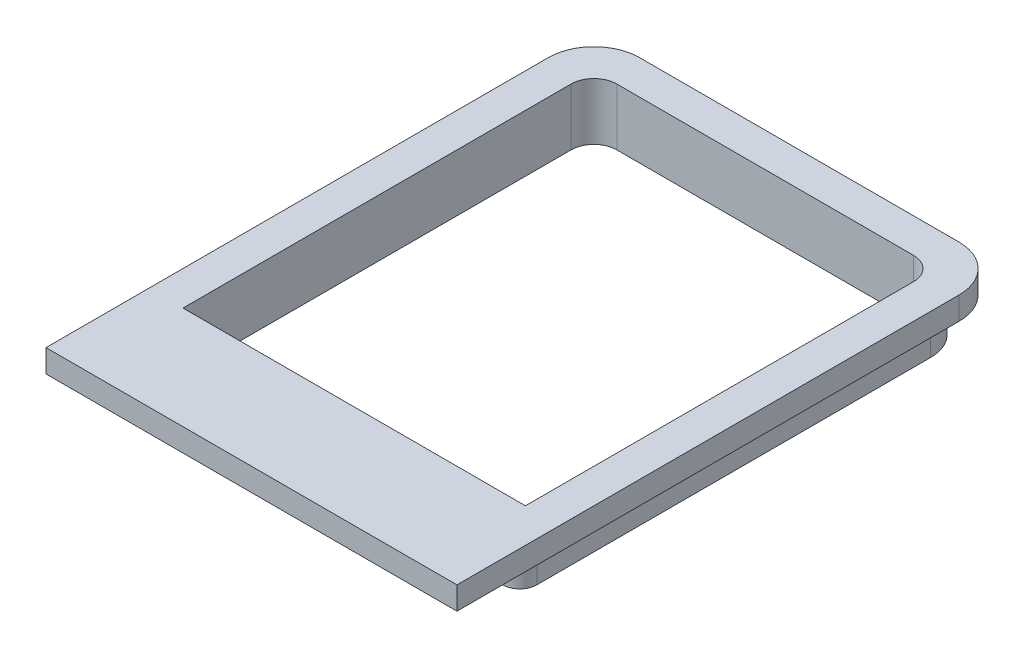
ISO-10303-21;
HEADER;
FILE_DESCRIPTION(('STEP AP214'),'2;1');
FILE_NAME('part.step','',(''),(''),'','','');
FILE_SCHEMA(('AUTOMOTIVE_DESIGN { 1 0 10303 214 1 1 1 1 }'));
ENDSEC;
DATA;
#1=APPLICATION_CONTEXT('core data for automotive mechanical design processes');
#2=APPLICATION_PROTOCOL_DEFINITION('international standard','automotive_design',2000,#1);
#3=PRODUCT_CONTEXT('',#1,'mechanical');
#4=PRODUCT('Part','Part','',(#3));
#5=PRODUCT_RELATED_PRODUCT_CATEGORY('part','',(#4));
#6=PRODUCT_DEFINITION_FORMATION('','',#4);
#7=PRODUCT_DEFINITION_CONTEXT('part definition',#1,'design');
#8=PRODUCT_DEFINITION('design','',#6,#7);
#9=PRODUCT_DEFINITION_SHAPE('','',#8);
#10=(LENGTH_UNIT() NAMED_UNIT(*) SI_UNIT(.MILLI.,.METRE.));
#11=(NAMED_UNIT(*) PLANE_ANGLE_UNIT() SI_UNIT($,.RADIAN.));
#12=(NAMED_UNIT(*) SI_UNIT($,.STERADIAN.) SOLID_ANGLE_UNIT());
#13=UNCERTAINTY_MEASURE_WITH_UNIT(LENGTH_MEASURE(1.E-05),#10,'distance_accuracy_value','');
#14=(GEOMETRIC_REPRESENTATION_CONTEXT(3) GLOBAL_UNCERTAINTY_ASSIGNED_CONTEXT((#13)) GLOBAL_UNIT_ASSIGNED_CONTEXT((#10,
#11,#12)) REPRESENTATION_CONTEXT('',''));
#15=CARTESIAN_POINT('',(0.,0.,0.));
#16=DIRECTION('',(0.,0.,1.));
#17=DIRECTION('',(1.,0.,0.));
#18=AXIS2_PLACEMENT_3D('',#15,#16,#17);
#19=CARTESIAN_POINT('',(6.50000000000001,9.5,-9.5));
#20=DIRECTION('',(0.,1.,0.));
#21=DIRECTION('',(0.,0.,1.));
#22=AXIS2_PLACEMENT_3D('',#19,#20,#21);
#23=PLANE('',#22);
#24=DIRECTION('',(0.,0.,1.));
#25=VECTOR('',#24,1.);
#26=CARTESIAN_POINT('',(-8.25000000000001,9.5,7.75));
#27=LINE('',#26,#25);
#28=CARTESIAN_POINT('',(-8.25,9.5,-9.49999999999999));
#29=VERTEX_POINT('',#28);
#30=CARTESIAN_POINT('',(-8.25000000000001,9.5,7.75));
#31=VERTEX_POINT('',#30);
#32=EDGE_CURVE('E138',#29,#31,#27,.T.);
#33=ORIENTED_EDGE('',*,*,#32,.F.);
#34=CARTESIAN_POINT('',(-6.5,9.5,-9.5));
#35=DIRECTION('',(0.,1.,0.));
#36=DIRECTION('',(0.,0.,1.));
#37=AXIS2_PLACEMENT_3D('',#34,#35,#36);
#38=CIRCLE('',#37,1.75);
#39=CARTESIAN_POINT('',(-6.50000000000001,9.5,-11.25));
#40=VERTEX_POINT('',#39);
#41=EDGE_CURVE('E215',#40,#29,#38,.T.);
#42=ORIENTED_EDGE('',*,*,#41,.F.);
#43=DIRECTION('',(-1.,0.,0.));
#44=VECTOR('',#43,1.);
#45=CARTESIAN_POINT('',(-6.50000000000001,9.5,-11.25));
#46=LINE('',#45,#44);
#47=CARTESIAN_POINT('',(6.50000000000001,9.5,-11.25));
#48=VERTEX_POINT('',#47);
#49=EDGE_CURVE('E210',#48,#40,#46,.T.);
#50=ORIENTED_EDGE('',*,*,#49,.F.);
#51=CARTESIAN_POINT('',(6.50000000000001,9.5,-9.5));
#52=DIRECTION('',(0.,1.,0.));
#53=DIRECTION('',(0.,0.,1.));
#54=AXIS2_PLACEMENT_3D('',#51,#52,#53);
#55=CIRCLE('',#54,1.75);
#56=CARTESIAN_POINT('',(8.25000000000001,9.5,-9.5));
#57=VERTEX_POINT('',#56);
#58=EDGE_CURVE('E202',#57,#48,#55,.T.);
#59=ORIENTED_EDGE('',*,*,#58,.F.);
#60=DIRECTION('',(0.,0.,-1.));
#61=VECTOR('',#60,1.);
#62=CARTESIAN_POINT('',(8.25000000000001,9.5,-9.5));
#63=LINE('',#62,#61);
#64=CARTESIAN_POINT('',(8.25000000000001,9.5,7.75));
#65=VERTEX_POINT('',#64);
#66=EDGE_CURVE('E201',#65,#57,#63,.T.);
#67=ORIENTED_EDGE('',*,*,#66,.F.);
#68=CARTESIAN_POINT('',(7.50000000000001,9.5,7.75));
#69=DIRECTION('',(0.,1.,0.));
#70=DIRECTION('',(0.,0.,1.));
#71=AXIS2_PLACEMENT_3D('',#68,#69,#70);
#72=CIRCLE('',#71,0.749999999999999);
#73=CARTESIAN_POINT('',(7.50000000000001,9.5,8.5));
#74=VERTEX_POINT('',#73);
#75=EDGE_CURVE('E331',#74,#65,#72,.T.);
#76=ORIENTED_EDGE('',*,*,#75,.F.);
#77=DIRECTION('',(0.,0.,1.));
#78=VECTOR('',#77,1.);
#79=CARTESIAN_POINT('',(7.50000000000001,9.5,8.5));
#80=LINE('',#79,#78);
#81=CARTESIAN_POINT('',(7.50000000000001,9.5,7.5));
#82=VERTEX_POINT('',#81);
#83=EDGE_CURVE('E325',#82,#74,#80,.T.);
#84=ORIENTED_EDGE('',*,*,#83,.F.);
#85=CARTESIAN_POINT('',(7.50000000000001,9.5,-9.5));
#86=VERTEX_POINT('',#85);
#87=EDGE_CURVE('E235',#86,#82,#80,.T.);
#88=ORIENTED_EDGE('',*,*,#87,.F.);
#89=CARTESIAN_POINT('',(6.50000000000001,9.5,-9.5));
#90=DIRECTION('',(0.,1.,0.));
#91=DIRECTION('',(0.,0.,1.));
#92=AXIS2_PLACEMENT_3D('',#89,#90,#91);
#93=CIRCLE('',#92,1.);
#94=CARTESIAN_POINT('',(6.5,9.5,-10.5));
#95=VERTEX_POINT('',#94);
#96=EDGE_CURVE('E236',#95,#86,#93,.F.);
#97=ORIENTED_EDGE('',*,*,#96,.F.);
#98=DIRECTION('',(1.,0.,0.));
#99=VECTOR('',#98,1.);
#100=CARTESIAN_POINT('',(6.5,9.5,-10.5));
#101=LINE('',#100,#99);
#102=CARTESIAN_POINT('',(-6.5,9.5,-10.5));
#103=VERTEX_POINT('',#102);
#104=EDGE_CURVE('E239',#103,#95,#101,.T.);
#105=ORIENTED_EDGE('',*,*,#104,.F.);
#106=CARTESIAN_POINT('',(-6.5,9.5,-9.5));
#107=DIRECTION('',(0.,1.,0.));
#108=DIRECTION('',(0.,0.,1.));
#109=AXIS2_PLACEMENT_3D('',#106,#107,#108);
#110=CIRCLE('',#109,1.);
#111=CARTESIAN_POINT('',(-7.5,9.5,-9.5));
#112=VERTEX_POINT('',#111);
#113=EDGE_CURVE('E242',#112,#103,#110,.F.);
#114=ORIENTED_EDGE('',*,*,#113,.F.);
#115=DIRECTION('',(0.,0.,-1.));
#116=VECTOR('',#115,1.);
#117=CARTESIAN_POINT('',(-7.5,9.5,-9.5));
#118=LINE('',#117,#116);
#119=CARTESIAN_POINT('',(-7.5,9.5,7.5));
#120=VERTEX_POINT('',#119);
#121=EDGE_CURVE('E234',#120,#112,#118,.T.);
#122=ORIENTED_EDGE('',*,*,#121,.F.);
#123=CARTESIAN_POINT('',(-7.5,9.5,8.5));
#124=VERTEX_POINT('',#123);
#125=EDGE_CURVE('E323',#124,#120,#118,.T.);
#126=ORIENTED_EDGE('',*,*,#125,.F.);
#127=CARTESIAN_POINT('',(-7.50000000000001,9.5,7.75));
#128=DIRECTION('',(0.,1.,0.));
#129=DIRECTION('',(0.,0.,1.));
#130=AXIS2_PLACEMENT_3D('',#127,#128,#129);
#131=CIRCLE('',#130,0.75);
#132=EDGE_CURVE('E223',#31,#124,#131,.T.);
#133=ORIENTED_EDGE('',*,*,#132,.F.);
#134=EDGE_LOOP('',(#33,#42,#50,#59,#67,#76,#84,#88,#97,#105,#114,#122,#126,#133));
#135=FACE_BOUND('',#134,.T.);
#136=ADVANCED_FACE('F41',(#135),#23,.F.);
#137=CARTESIAN_POINT('',(-7.,11.,26.8660687473185));
#138=DIRECTION('',(0.,1.,0.));
#139=DIRECTION('',(0.,0.,1.));
#140=AXIS2_PLACEMENT_3D('',#137,#138,#139);
#141=PLANE('',#140);
#142=DIRECTION('',(0.,0.,-1.));
#143=VECTOR('',#142,1.);
#144=CARTESIAN_POINT('',(9.00000000000001,11.,-12.));
#145=LINE('',#144,#143);
#146=CARTESIAN_POINT('',(9.00000000000001,11.,12.));
#147=VERTEX_POINT('',#146);
#148=CARTESIAN_POINT('',(9.00000000000001,11.,-10.));
#149=VERTEX_POINT('',#148);
#150=EDGE_CURVE('E245',#147,#149,#145,.T.);
#151=ORIENTED_EDGE('',*,*,#150,.F.);
#152=DIRECTION('',(-1.,0.,0.));
#153=VECTOR('',#152,1.);
#154=CARTESIAN_POINT('',(-7.,11.,12.));
#155=LINE('',#154,#153);
#156=CARTESIAN_POINT('',(-9.00000000000001,11.,12.));
#157=VERTEX_POINT('',#156);
#158=EDGE_CURVE('E58',#147,#157,#155,.T.);
#159=ORIENTED_EDGE('',*,*,#158,.T.);
#160=DIRECTION('',(0.,0.,-1.));
#161=VECTOR('',#160,1.);
#162=CARTESIAN_POINT('',(-9.00000000000001,11.,-10.));
#163=LINE('',#162,#161);
#164=CARTESIAN_POINT('',(-9.00000000000001,11.,-10.));
#165=VERTEX_POINT('',#164);
#166=EDGE_CURVE('E257',#157,#165,#163,.T.);
#167=ORIENTED_EDGE('',*,*,#166,.T.);
#168=CARTESIAN_POINT('',(-7.,11.,-10.));
#169=DIRECTION('',(0.,1.,0.));
#170=DIRECTION('',(0.,0.,1.));
#171=AXIS2_PLACEMENT_3D('',#168,#169,#170);
#172=CIRCLE('',#171,2.);
#173=CARTESIAN_POINT('',(-7.,11.,-12.));
#174=VERTEX_POINT('',#173);
#175=EDGE_CURVE('E254',#165,#174,#172,.F.);
#176=ORIENTED_EDGE('',*,*,#175,.T.);
#177=DIRECTION('',(1.,0.,0.));
#178=VECTOR('',#177,1.);
#179=CARTESIAN_POINT('',(7.,11.,-12.));
#180=LINE('',#179,#178);
#181=CARTESIAN_POINT('',(7.,11.,-12.));
#182=VERTEX_POINT('',#181);
#183=EDGE_CURVE('E251',#174,#182,#180,.T.);
#184=ORIENTED_EDGE('',*,*,#183,.T.);
#185=CARTESIAN_POINT('',(7.,11.,-10.));
#186=DIRECTION('',(0.,1.,0.));
#187=DIRECTION('',(0.,0.,1.));
#188=AXIS2_PLACEMENT_3D('',#185,#186,#187);
#189=CIRCLE('',#188,2.);
#190=EDGE_CURVE('E248',#182,#149,#189,.F.);
#191=ORIENTED_EDGE('',*,*,#190,.T.);
#192=EDGE_LOOP('',(#151,#159,#167,#176,#184,#191));
#193=FACE_BOUND('',#192,.T.);
#194=DIRECTION('',(0.,0.,1.));
#195=VECTOR('',#194,1.);
#196=CARTESIAN_POINT('',(-7.5,11.,-9.5));
#197=LINE('',#196,#195);
#198=CARTESIAN_POINT('',(-7.5,11.,7.5));
#199=VERTEX_POINT('',#198);
#200=CARTESIAN_POINT('',(-7.5,11.,8.5));
#201=VERTEX_POINT('',#200);
#202=EDGE_CURVE('E11',#199,#201,#197,.T.);
#203=ORIENTED_EDGE('',*,*,#202,.F.);
#204=DIRECTION('',(-1.,0.,0.));
#205=VECTOR('',#204,1.);
#206=CARTESIAN_POINT('',(-7.5,11.,7.5));
#207=LINE('',#206,#205);
#208=CARTESIAN_POINT('',(7.50000000000001,11.,7.5));
#209=VERTEX_POINT('',#208);
#210=EDGE_CURVE('E231',#209,#199,#207,.T.);
#211=ORIENTED_EDGE('',*,*,#210,.F.);
#212=DIRECTION('',(0.,0.,-1.));
#213=VECTOR('',#212,1.);
#214=CARTESIAN_POINT('',(7.50000000000001,11.,8.5));
#215=LINE('',#214,#213);
#216=CARTESIAN_POINT('',(7.50000000000001,11.,8.5));
#217=VERTEX_POINT('',#216);
#218=EDGE_CURVE('E50',#217,#209,#215,.T.);
#219=ORIENTED_EDGE('',*,*,#218,.F.);
#220=CARTESIAN_POINT('',(7.50000000000001,11.,7.75));
#221=DIRECTION('',(0.,-1.,0.));
#222=DIRECTION('',(0.,0.,-1.));
#223=AXIS2_PLACEMENT_3D('',#220,#221,#222);
#224=CIRCLE('',#223,0.749999999999999);
#225=CARTESIAN_POINT('',(8.25000000000001,11.,7.75));
#226=VERTEX_POINT('',#225);
#227=EDGE_CURVE('E183',#226,#217,#224,.T.);
#228=ORIENTED_EDGE('',*,*,#227,.F.);
#229=DIRECTION('',(0.,0.,1.));
#230=VECTOR('',#229,1.);
#231=CARTESIAN_POINT('',(8.25000000000001,11.,-9.5));
#232=LINE('',#231,#230);
#233=CARTESIAN_POINT('',(8.25000000000001,11.,-9.5));
#234=VERTEX_POINT('',#233);
#235=EDGE_CURVE('E178',#234,#226,#232,.T.);
#236=ORIENTED_EDGE('',*,*,#235,.F.);
#237=CARTESIAN_POINT('',(6.50000000000001,11.,-9.5));
#238=DIRECTION('',(0.,-1.,0.));
#239=DIRECTION('',(0.,0.,-1.));
#240=AXIS2_PLACEMENT_3D('',#237,#238,#239);
#241=CIRCLE('',#240,1.75);
#242=CARTESIAN_POINT('',(6.50000000000001,11.,-11.25));
#243=VERTEX_POINT('',#242);
#244=EDGE_CURVE('E181',#243,#234,#241,.T.);
#245=ORIENTED_EDGE('',*,*,#244,.F.);
#246=DIRECTION('',(1.,0.,0.));
#247=VECTOR('',#246,1.);
#248=CARTESIAN_POINT('',(-6.50000000000001,11.,-11.25));
#249=LINE('',#248,#247);
#250=CARTESIAN_POINT('',(-6.50000000000001,11.,-11.25));
#251=VERTEX_POINT('',#250);
#252=EDGE_CURVE('E197',#251,#243,#249,.T.);
#253=ORIENTED_EDGE('',*,*,#252,.F.);
#254=CARTESIAN_POINT('',(-6.5,11.,-9.5));
#255=DIRECTION('',(0.,-1.,0.));
#256=DIRECTION('',(0.,0.,-1.));
#257=AXIS2_PLACEMENT_3D('',#254,#255,#256);
#258=CIRCLE('',#257,1.75);
#259=CARTESIAN_POINT('',(-8.25,11.,-9.49999999999999));
#260=VERTEX_POINT('',#259);
#261=EDGE_CURVE('E311',#260,#251,#258,.T.);
#262=ORIENTED_EDGE('',*,*,#261,.F.);
#263=DIRECTION('',(0.,0.,-1.));
#264=VECTOR('',#263,1.);
#265=CARTESIAN_POINT('',(-8.25000000000001,11.,7.75));
#266=LINE('',#265,#264);
#267=CARTESIAN_POINT('',(-8.25000000000001,11.,7.75));
#268=VERTEX_POINT('',#267);
#269=EDGE_CURVE('E314',#268,#260,#266,.T.);
#270=ORIENTED_EDGE('',*,*,#269,.F.);
#271=CARTESIAN_POINT('',(-7.50000000000001,11.,7.75));
#272=DIRECTION('',(0.,-1.,0.));
#273=DIRECTION('',(0.,0.,-1.));
#274=AXIS2_PLACEMENT_3D('',#271,#272,#273);
#275=CIRCLE('',#274,0.75);
#276=EDGE_CURVE('E317',#201,#268,#275,.T.);
#277=ORIENTED_EDGE('',*,*,#276,.F.);
#278=EDGE_LOOP('',(#203,#211,#219,#228,#236,#245,#253,#262,#270,#277));
#279=FACE_BOUND('',#278,.T.);
#280=ADVANCED_FACE('F180',(#193,#279),#141,.F.);
#281=CARTESIAN_POINT('',(-7.5,1.5,-10.5));
#282=DIRECTION('',(1.,0.,0.));
#283=DIRECTION('',(0.,0.,-1.));
#284=AXIS2_PLACEMENT_3D('',#281,#282,#283);
#285=PLANE('',#284);
#286=ORIENTED_EDGE('',*,*,#125,.T.);
#287=DIRECTION('',(0.,1.,0.));
#288=VECTOR('',#287,1.);
#289=CARTESIAN_POINT('',(-7.5,7.998,7.5));
#290=LINE('',#289,#288);
#291=EDGE_CURVE('E260',#120,#199,#290,.T.);
#292=ORIENTED_EDGE('',*,*,#291,.T.);
#293=ORIENTED_EDGE('',*,*,#202,.T.);
#294=DIRECTION('',(0.,1.,0.));
#295=VECTOR('',#294,1.);
#296=CARTESIAN_POINT('',(-7.5,-0.00200000000000027,8.5));
#297=LINE('',#296,#295);
#298=EDGE_CURVE('E320',#124,#201,#297,.T.);
#299=ORIENTED_EDGE('',*,*,#298,.F.);
#300=EDGE_LOOP('',(#286,#292,#293,#299));
#301=FACE_BOUND('',#300,.T.);
#302=ADVANCED_FACE('F352',(#301),#285,.T.);
#303=CARTESIAN_POINT('',(7.50000000000001,1.5,-10.5));
#304=DIRECTION('',(-1.,0.,0.));
#305=DIRECTION('',(0.,0.,1.));
#306=AXIS2_PLACEMENT_3D('',#303,#304,#305);
#307=PLANE('',#306);
#308=ORIENTED_EDGE('',*,*,#218,.T.);
#309=DIRECTION('',(0.,1.,0.));
#310=VECTOR('',#309,1.);
#311=CARTESIAN_POINT('',(7.50000000000001,7.998,7.5));
#312=LINE('',#311,#310);
#313=EDGE_CURVE('E230',#82,#209,#312,.T.);
#314=ORIENTED_EDGE('',*,*,#313,.F.);
#315=ORIENTED_EDGE('',*,*,#83,.T.);
#316=DIRECTION('',(0.,1.,0.));
#317=VECTOR('',#316,1.);
#318=CARTESIAN_POINT('',(7.50000000000001,-0.00200000000000027,8.5));
#319=LINE('',#318,#317);
#320=EDGE_CURVE('E328',#74,#217,#319,.T.);
#321=ORIENTED_EDGE('',*,*,#320,.T.);
#322=EDGE_LOOP('',(#308,#314,#315,#321));
#323=FACE_BOUND('',#322,.T.);
#324=ADVANCED_FACE('F373',(#323),#307,.T.);
#325=CARTESIAN_POINT('',(7.50000000000001,-0.00200000000000027,7.75));
#326=DIRECTION('',(0.,1.,0.));
#327=DIRECTION('',(0.,0.,1.));
#328=AXIS2_PLACEMENT_3D('',#325,#326,#327);
#329=CYLINDRICAL_SURFACE('',#328,0.749999999999999);
#330=ORIENTED_EDGE('',*,*,#320,.F.);
#331=ORIENTED_EDGE('',*,*,#75,.T.);
#332=DIRECTION('',(0.,1.,0.));
#333=VECTOR('',#332,1.);
#334=CARTESIAN_POINT('',(8.25000000000001,-0.00200000000000027,7.75));
#335=LINE('',#334,#333);
#336=EDGE_CURVE('E204',#65,#226,#335,.T.);
#337=ORIENTED_EDGE('',*,*,#336,.T.);
#338=ORIENTED_EDGE('',*,*,#227,.T.);
#339=EDGE_LOOP('',(#330,#331,#337,#338));
#340=FACE_BOUND('',#339,.T.);
#341=ADVANCED_FACE('F334',(#340),#329,.T.);
#342=CARTESIAN_POINT('',(8.25000000000001,-0.00200000000000027,-9.5));
#343=DIRECTION('',(-1.,0.,0.));
#344=DIRECTION('',(0.,0.,1.));
#345=AXIS2_PLACEMENT_3D('',#342,#343,#344);
#346=PLANE('',#345);
#347=ORIENTED_EDGE('',*,*,#336,.F.);
#348=ORIENTED_EDGE('',*,*,#66,.T.);
#349=DIRECTION('',(0.,1.,0.));
#350=VECTOR('',#349,1.);
#351=CARTESIAN_POINT('',(8.25000000000001,-0.00200000000000027,-9.5));
#352=LINE('',#351,#350);
#353=EDGE_CURVE('E193',#57,#234,#352,.T.);
#354=ORIENTED_EDGE('',*,*,#353,.T.);
#355=ORIENTED_EDGE('',*,*,#235,.T.);
#356=EDGE_LOOP('',(#347,#348,#354,#355));
#357=FACE_BOUND('',#356,.T.);
#358=ADVANCED_FACE('F199',(#357),#346,.F.);
#359=CARTESIAN_POINT('',(6.50000000000001,-0.00200000000000027,-9.5));
#360=DIRECTION('',(0.,1.,0.));
#361=DIRECTION('',(0.,0.,1.));
#362=AXIS2_PLACEMENT_3D('',#359,#360,#361);
#363=CYLINDRICAL_SURFACE('',#362,1.75);
#364=ORIENTED_EDGE('',*,*,#353,.F.);
#365=ORIENTED_EDGE('',*,*,#58,.T.);
#366=DIRECTION('',(0.,1.,0.));
#367=VECTOR('',#366,1.);
#368=CARTESIAN_POINT('',(6.50000000000001,-0.00200000000000027,-11.25));
#369=LINE('',#368,#367);
#370=EDGE_CURVE('E196',#48,#243,#369,.T.);
#371=ORIENTED_EDGE('',*,*,#370,.T.);
#372=ORIENTED_EDGE('',*,*,#244,.T.);
#373=EDGE_LOOP('',(#364,#365,#371,#372));
#374=FACE_BOUND('',#373,.T.);
#375=ADVANCED_FACE('F192',(#374),#363,.T.);
#376=CARTESIAN_POINT('',(-6.50000000000001,-0.00200000000000027,-11.25));
#377=DIRECTION('',(0.,0.,1.));
#378=DIRECTION('',(1.,0.,0.));
#379=AXIS2_PLACEMENT_3D('',#376,#377,#378);
#380=PLANE('',#379);
#381=ORIENTED_EDGE('',*,*,#370,.F.);
#382=ORIENTED_EDGE('',*,*,#49,.T.);
#383=DIRECTION('',(0.,1.,0.));
#384=VECTOR('',#383,1.);
#385=CARTESIAN_POINT('',(-6.50000000000001,-0.00200000000000027,-11.25));
#386=LINE('',#385,#384);
#387=EDGE_CURVE('E212',#40,#251,#386,.T.);
#388=ORIENTED_EDGE('',*,*,#387,.T.);
#389=ORIENTED_EDGE('',*,*,#252,.T.);
#390=EDGE_LOOP('',(#381,#382,#388,#389));
#391=FACE_BOUND('',#390,.T.);
#392=ADVANCED_FACE('F340',(#391),#380,.F.);
#393=CARTESIAN_POINT('',(-6.5,-0.00200000000000027,-9.5));
#394=DIRECTION('',(0.,1.,0.));
#395=DIRECTION('',(0.,0.,1.));
#396=AXIS2_PLACEMENT_3D('',#393,#394,#395);
#397=CYLINDRICAL_SURFACE('',#396,1.75);
#398=ORIENTED_EDGE('',*,*,#387,.F.);
#399=ORIENTED_EDGE('',*,*,#41,.T.);
#400=DIRECTION('',(0.,1.,0.));
#401=VECTOR('',#400,1.);
#402=CARTESIAN_POINT('',(-8.25,-0.00200000000000027,-9.49999999999999));
#403=LINE('',#402,#401);
#404=EDGE_CURVE('E217',#29,#260,#403,.T.);
#405=ORIENTED_EDGE('',*,*,#404,.T.);
#406=ORIENTED_EDGE('',*,*,#261,.T.);
#407=EDGE_LOOP('',(#398,#399,#405,#406));
#408=FACE_BOUND('',#407,.T.);
#409=ADVANCED_FACE('F343',(#408),#397,.T.);
#410=CARTESIAN_POINT('',(-8.25000000000001,-0.00200000000000027,7.75));
#411=DIRECTION('',(1.,0.,0.));
#412=DIRECTION('',(0.,0.,-1.));
#413=AXIS2_PLACEMENT_3D('',#410,#411,#412);
#414=PLANE('',#413);
#415=ORIENTED_EDGE('',*,*,#404,.F.);
#416=ORIENTED_EDGE('',*,*,#32,.T.);
#417=DIRECTION('',(0.,1.,0.));
#418=VECTOR('',#417,1.);
#419=CARTESIAN_POINT('',(-8.25000000000001,-0.00200000000000027,7.75));
#420=LINE('',#419,#418);
#421=EDGE_CURVE('E221',#31,#268,#420,.T.);
#422=ORIENTED_EDGE('',*,*,#421,.T.);
#423=ORIENTED_EDGE('',*,*,#269,.T.);
#424=EDGE_LOOP('',(#415,#416,#422,#423));
#425=FACE_BOUND('',#424,.T.);
#426=ADVANCED_FACE('F344',(#425),#414,.F.);
#427=CARTESIAN_POINT('',(-7.50000000000001,-0.00200000000000027,7.75));
#428=DIRECTION('',(0.,1.,0.));
#429=DIRECTION('',(0.,0.,1.));
#430=AXIS2_PLACEMENT_3D('',#427,#428,#429);
#431=CYLINDRICAL_SURFACE('',#430,0.75);
#432=ORIENTED_EDGE('',*,*,#421,.F.);
#433=ORIENTED_EDGE('',*,*,#132,.T.);
#434=ORIENTED_EDGE('',*,*,#298,.T.);
#435=ORIENTED_EDGE('',*,*,#276,.T.);
#436=EDGE_LOOP('',(#432,#433,#434,#435));
#437=FACE_BOUND('',#436,.T.);
#438=ADVANCED_FACE('F349',(#437),#431,.T.);
#439=CARTESIAN_POINT('',(7.,12.,-10.));
#440=DIRECTION('',(0.,1.,0.));
#441=DIRECTION('',(0.,0.,1.));
#442=AXIS2_PLACEMENT_3D('',#439,#440,#441);
#443=PLANE('',#442);
#444=DIRECTION('',(-1.,0.,0.));
#445=VECTOR('',#444,1.);
#446=CARTESIAN_POINT('',(-9.00000000000001,12.,12.));
#447=LINE('',#446,#445);
#448=CARTESIAN_POINT('',(9.,12.,12.));
#449=VERTEX_POINT('',#448);
#450=CARTESIAN_POINT('',(-9.00000000000001,12.,12.));
#451=VERTEX_POINT('',#450);
#452=EDGE_CURVE('E586',#449,#451,#447,.T.);
#453=ORIENTED_EDGE('',*,*,#452,.F.);
#454=DIRECTION('',(0.,0.,-1.));
#455=VECTOR('',#454,1.);
#456=CARTESIAN_POINT('',(9.,12.,15.));
#457=LINE('',#456,#455);
#458=CARTESIAN_POINT('',(9.00000000000001,12.,-10.));
#459=VERTEX_POINT('',#458);
#460=EDGE_CURVE('E226',#449,#459,#457,.T.);
#461=ORIENTED_EDGE('',*,*,#460,.T.);
#462=CARTESIAN_POINT('',(7.,12.,-10.));
#463=DIRECTION('',(0.,1.,0.));
#464=DIRECTION('',(0.,0.,1.));
#465=AXIS2_PLACEMENT_3D('',#462,#463,#464);
#466=CIRCLE('',#465,2.);
#467=CARTESIAN_POINT('',(7.,12.,-12.));
#468=VERTEX_POINT('',#467);
#469=EDGE_CURVE('E591',#459,#468,#466,.T.);
#470=ORIENTED_EDGE('',*,*,#469,.T.);
#471=DIRECTION('',(-1.,0.,0.));
#472=VECTOR('',#471,1.);
#473=CARTESIAN_POINT('',(7.,12.,-12.));
#474=LINE('',#473,#472);
#475=CARTESIAN_POINT('',(-7.,12.,-12.));
#476=VERTEX_POINT('',#475);
#477=EDGE_CURVE('E590',#468,#476,#474,.T.);
#478=ORIENTED_EDGE('',*,*,#477,.T.);
#479=CARTESIAN_POINT('',(-7.,12.,-10.));
#480=DIRECTION('',(0.,1.,0.));
#481=DIRECTION('',(0.,0.,1.));
#482=AXIS2_PLACEMENT_3D('',#479,#480,#481);
#483=CIRCLE('',#482,2.);
#484=CARTESIAN_POINT('',(-9.00000000000001,12.,-10.));
#485=VERTEX_POINT('',#484);
#486=EDGE_CURVE('E589',#476,#485,#483,.T.);
#487=ORIENTED_EDGE('',*,*,#486,.T.);
#488=DIRECTION('',(0.,0.,1.));
#489=VECTOR('',#488,1.);
#490=CARTESIAN_POINT('',(-9.00000000000001,12.,-10.));
#491=LINE('',#490,#489);
#492=EDGE_CURVE('E295',#485,#451,#491,.T.);
#493=ORIENTED_EDGE('',*,*,#492,.T.);
#494=EDGE_LOOP('',(#453,#461,#470,#478,#487,#493));
#495=FACE_BOUND('',#494,.T.);
#496=CARTESIAN_POINT('',(-6.5,12.,-9.5));
#497=DIRECTION('',(0.,1.,0.));
#498=DIRECTION('',(0.,0.,1.));
#499=AXIS2_PLACEMENT_3D('',#496,#497,#498);
#500=CIRCLE('',#499,1.);
#501=CARTESIAN_POINT('',(-6.5,12.,-10.5));
#502=VERTEX_POINT('',#501);
#503=CARTESIAN_POINT('',(-7.5,12.,-9.5));
#504=VERTEX_POINT('',#503);
#505=EDGE_CURVE('E283',#502,#504,#500,.T.);
#506=ORIENTED_EDGE('',*,*,#505,.F.);
#507=DIRECTION('',(-1.,0.,0.));
#508=VECTOR('',#507,1.);
#509=CARTESIAN_POINT('',(6.5,12.,-10.5));
#510=LINE('',#509,#508);
#511=CARTESIAN_POINT('',(6.5,12.,-10.5));
#512=VERTEX_POINT('',#511);
#513=EDGE_CURVE('E305',#512,#502,#510,.T.);
#514=ORIENTED_EDGE('',*,*,#513,.F.);
#515=CARTESIAN_POINT('',(6.50000000000001,12.,-9.5));
#516=DIRECTION('',(0.,1.,0.));
#517=DIRECTION('',(0.,0.,1.));
#518=AXIS2_PLACEMENT_3D('',#515,#516,#517);
#519=CIRCLE('',#518,1.);
#520=CARTESIAN_POINT('',(7.50000000000001,12.,-9.5));
#521=VERTEX_POINT('',#520);
#522=EDGE_CURVE('E302',#521,#512,#519,.T.);
#523=ORIENTED_EDGE('',*,*,#522,.F.);
#524=DIRECTION('',(0.,0.,-1.));
#525=VECTOR('',#524,1.);
#526=CARTESIAN_POINT('',(7.50000000000001,12.,7.5));
#527=LINE('',#526,#525);
#528=CARTESIAN_POINT('',(7.50000000000001,12.,7.5));
#529=VERTEX_POINT('',#528);
#530=EDGE_CURVE('E299',#529,#521,#527,.T.);
#531=ORIENTED_EDGE('',*,*,#530,.F.);
#532=DIRECTION('',(1.,0.,0.));
#533=VECTOR('',#532,1.);
#534=CARTESIAN_POINT('',(-7.5,12.,7.5));
#535=LINE('',#534,#533);
#536=CARTESIAN_POINT('',(-7.5,12.,7.5));
#537=VERTEX_POINT('',#536);
#538=EDGE_CURVE('E292',#537,#529,#535,.T.);
#539=ORIENTED_EDGE('',*,*,#538,.F.);
#540=DIRECTION('',(0.,0.,1.));
#541=VECTOR('',#540,1.);
#542=CARTESIAN_POINT('',(-7.5,12.,-9.5));
#543=LINE('',#542,#541);
#544=EDGE_CURVE('E288',#504,#537,#543,.T.);
#545=ORIENTED_EDGE('',*,*,#544,.F.);
#546=EDGE_LOOP('',(#506,#514,#523,#531,#539,#545));
#547=FACE_BOUND('',#546,.T.);
#548=ADVANCED_FACE('F414',(#495,#547),#443,.T.);
#549=CARTESIAN_POINT('',(-7.5,7.998,-9.5));
#550=DIRECTION('',(-1.,0.,0.));
#551=DIRECTION('',(0.,0.,1.));
#552=AXIS2_PLACEMENT_3D('',#549,#550,#551);
#553=PLANE('',#552);
#554=DIRECTION('',(0.,1.,0.));
#555=VECTOR('',#554,1.);
#556=CARTESIAN_POINT('',(-7.5,7.998,-9.5));
#557=LINE('',#556,#555);
#558=EDGE_CURVE('E45',#112,#504,#557,.T.);
#559=ORIENTED_EDGE('',*,*,#558,.T.);
#560=ORIENTED_EDGE('',*,*,#544,.T.);
#561=EDGE_CURVE('E229',#199,#537,#290,.T.);
#562=ORIENTED_EDGE('',*,*,#561,.F.);
#563=ORIENTED_EDGE('',*,*,#291,.F.);
#564=ORIENTED_EDGE('',*,*,#121,.T.);
#565=EDGE_LOOP('',(#559,#560,#562,#563,#564));
#566=FACE_BOUND('',#565,.T.);
#567=ADVANCED_FACE('F43',(#566),#553,.F.);
#568=CARTESIAN_POINT('',(-7.5,7.998,7.5));
#569=DIRECTION('',(0.,0.,1.));
#570=DIRECTION('',(1.,0.,0.));
#571=AXIS2_PLACEMENT_3D('',#568,#569,#570);
#572=PLANE('',#571);
#573=EDGE_CURVE('E227',#209,#529,#312,.T.);
#574=ORIENTED_EDGE('',*,*,#573,.F.);
#575=ORIENTED_EDGE('',*,*,#210,.T.);
#576=ORIENTED_EDGE('',*,*,#561,.T.);
#577=ORIENTED_EDGE('',*,*,#538,.T.);
#578=EDGE_LOOP('',(#574,#575,#576,#577));
#579=FACE_BOUND('',#578,.T.);
#580=ADVANCED_FACE('F368',(#579),#572,.F.);
#581=CARTESIAN_POINT('',(7.50000000000001,7.998,7.5));
#582=DIRECTION('',(1.,0.,0.));
#583=DIRECTION('',(0.,0.,-1.));
#584=AXIS2_PLACEMENT_3D('',#581,#582,#583);
#585=PLANE('',#584);
#586=ORIENTED_EDGE('',*,*,#313,.T.);
#587=ORIENTED_EDGE('',*,*,#573,.T.);
#588=ORIENTED_EDGE('',*,*,#530,.T.);
#589=DIRECTION('',(0.,1.,0.));
#590=VECTOR('',#589,1.);
#591=CARTESIAN_POINT('',(7.50000000000001,7.998,-9.5));
#592=LINE('',#591,#590);
#593=EDGE_CURVE('E273',#86,#521,#592,.T.);
#594=ORIENTED_EDGE('',*,*,#593,.F.);
#595=ORIENTED_EDGE('',*,*,#87,.T.);
#596=EDGE_LOOP('',(#586,#587,#588,#594,#595));
#597=FACE_BOUND('',#596,.T.);
#598=ADVANCED_FACE('F358',(#597),#585,.F.);
#599=CARTESIAN_POINT('',(-6.5,7.998,-9.5));
#600=DIRECTION('',(0.,1.,0.));
#601=DIRECTION('',(0.,0.,1.));
#602=AXIS2_PLACEMENT_3D('',#599,#600,#601);
#603=CYLINDRICAL_SURFACE('',#602,1.);
#604=DIRECTION('',(0.,1.,0.));
#605=VECTOR('',#604,1.);
#606=CARTESIAN_POINT('',(-6.5,7.998,-10.5));
#607=LINE('',#606,#605);
#608=EDGE_CURVE('E269',#103,#502,#607,.T.);
#609=ORIENTED_EDGE('',*,*,#608,.T.);
#610=ORIENTED_EDGE('',*,*,#505,.T.);
#611=ORIENTED_EDGE('',*,*,#558,.F.);
#612=ORIENTED_EDGE('',*,*,#113,.T.);
#613=EDGE_LOOP('',(#609,#610,#611,#612));
#614=FACE_BOUND('',#613,.T.);
#615=ADVANCED_FACE('F355',(#614),#603,.F.);
#616=CARTESIAN_POINT('',(7.,7.998,-10.));
#617=DIRECTION('',(0.,1.,0.));
#618=DIRECTION('',(0.,0.,1.));
#619=AXIS2_PLACEMENT_3D('',#616,#617,#618);
#620=CYLINDRICAL_SURFACE('',#619,2.);
#621=ORIENTED_EDGE('',*,*,#190,.F.);
#622=DIRECTION('',(0.,1.,0.));
#623=VECTOR('',#622,1.);
#624=CARTESIAN_POINT('',(7.,7.998,-12.));
#625=LINE('',#624,#623);
#626=EDGE_CURVE('E264',#182,#468,#625,.T.);
#627=ORIENTED_EDGE('',*,*,#626,.T.);
#628=ORIENTED_EDGE('',*,*,#469,.F.);
#629=DIRECTION('',(0.,1.,0.));
#630=VECTOR('',#629,1.);
#631=CARTESIAN_POINT('',(9.00000000000001,7.998,-10.));
#632=LINE('',#631,#630);
#633=EDGE_CURVE('E261',#149,#459,#632,.T.);
#634=ORIENTED_EDGE('',*,*,#633,.F.);
#635=EDGE_LOOP('',(#621,#627,#628,#634));
#636=FACE_BOUND('',#635,.T.);
#637=ADVANCED_FACE('F357',(#636),#620,.T.);
#638=CARTESIAN_POINT('',(7.,7.998,-12.));
#639=DIRECTION('',(0.,0.,-1.));
#640=DIRECTION('',(-1.,0.,0.));
#641=AXIS2_PLACEMENT_3D('',#638,#639,#640);
#642=PLANE('',#641);
#643=ORIENTED_EDGE('',*,*,#183,.F.);
#644=DIRECTION('',(0.,1.,0.));
#645=VECTOR('',#644,1.);
#646=CARTESIAN_POINT('',(-7.,7.998,-12.));
#647=LINE('',#646,#645);
#648=EDGE_CURVE('E266',#174,#476,#647,.T.);
#649=ORIENTED_EDGE('',*,*,#648,.T.);
#650=ORIENTED_EDGE('',*,*,#477,.F.);
#651=ORIENTED_EDGE('',*,*,#626,.F.);
#652=EDGE_LOOP('',(#643,#649,#650,#651));
#653=FACE_BOUND('',#652,.T.);
#654=ADVANCED_FACE('F365',(#653),#642,.T.);
#655=CARTESIAN_POINT('',(-7.,7.998,-10.));
#656=DIRECTION('',(0.,1.,0.));
#657=DIRECTION('',(0.,0.,1.));
#658=AXIS2_PLACEMENT_3D('',#655,#656,#657);
#659=CYLINDRICAL_SURFACE('',#658,2.);
#660=ORIENTED_EDGE('',*,*,#175,.F.);
#661=DIRECTION('',(0.,1.,0.));
#662=VECTOR('',#661,1.);
#663=CARTESIAN_POINT('',(-9.00000000000001,7.998,-10.));
#664=LINE('',#663,#662);
#665=EDGE_CURVE('E129',#165,#485,#664,.T.);
#666=ORIENTED_EDGE('',*,*,#665,.T.);
#667=ORIENTED_EDGE('',*,*,#486,.F.);
#668=ORIENTED_EDGE('',*,*,#648,.F.);
#669=EDGE_LOOP('',(#660,#666,#667,#668));
#670=FACE_BOUND('',#669,.T.);
#671=ADVANCED_FACE('F387',(#670),#659,.T.);
#672=CARTESIAN_POINT('',(-9.00000000000001,7.998,-10.));
#673=DIRECTION('',(-1.,0.,0.));
#674=DIRECTION('',(0.,0.,1.));
#675=AXIS2_PLACEMENT_3D('',#672,#673,#674);
#676=PLANE('',#675);
#677=DIRECTION('',(0.,1.,0.));
#678=VECTOR('',#677,1.);
#679=CARTESIAN_POINT('',(-9.00000000000001,2.,12.));
#680=LINE('',#679,#678);
#681=EDGE_CURVE('E277',#157,#451,#680,.T.);
#682=ORIENTED_EDGE('',*,*,#681,.T.);
#683=ORIENTED_EDGE('',*,*,#492,.F.);
#684=ORIENTED_EDGE('',*,*,#665,.F.);
#685=ORIENTED_EDGE('',*,*,#166,.F.);
#686=EDGE_LOOP('',(#682,#683,#684,#685));
#687=FACE_BOUND('',#686,.T.);
#688=ADVANCED_FACE('F391',(#687),#676,.T.);
#689=CARTESIAN_POINT('',(9.,7.998,15.));
#690=DIRECTION('',(1.,0.,0.));
#691=DIRECTION('',(0.,0.,-1.));
#692=AXIS2_PLACEMENT_3D('',#689,#690,#691);
#693=PLANE('',#692);
#694=DIRECTION('',(0.,1.,0.));
#695=VECTOR('',#694,1.);
#696=CARTESIAN_POINT('',(9.,2.,12.));
#697=LINE('',#696,#695);
#698=EDGE_CURVE('E584',#147,#449,#697,.T.);
#699=ORIENTED_EDGE('',*,*,#698,.F.);
#700=ORIENTED_EDGE('',*,*,#150,.T.);
#701=ORIENTED_EDGE('',*,*,#633,.T.);
#702=ORIENTED_EDGE('',*,*,#460,.F.);
#703=EDGE_LOOP('',(#699,#700,#701,#702));
#704=FACE_BOUND('',#703,.T.);
#705=ADVANCED_FACE('F399',(#704),#693,.T.);
#706=CARTESIAN_POINT('',(6.50000000000001,7.998,-9.5));
#707=DIRECTION('',(0.,1.,0.));
#708=DIRECTION('',(0.,0.,1.));
#709=AXIS2_PLACEMENT_3D('',#706,#707,#708);
#710=CYLINDRICAL_SURFACE('',#709,1.);
#711=ORIENTED_EDGE('',*,*,#593,.T.);
#712=ORIENTED_EDGE('',*,*,#522,.T.);
#713=DIRECTION('',(0.,1.,0.));
#714=VECTOR('',#713,1.);
#715=CARTESIAN_POINT('',(6.5,7.998,-10.5));
#716=LINE('',#715,#714);
#717=EDGE_CURVE('E271',#95,#512,#716,.T.);
#718=ORIENTED_EDGE('',*,*,#717,.F.);
#719=ORIENTED_EDGE('',*,*,#96,.T.);
#720=EDGE_LOOP('',(#711,#712,#718,#719));
#721=FACE_BOUND('',#720,.T.);
#722=ADVANCED_FACE('F396',(#721),#710,.F.);
#723=CARTESIAN_POINT('',(6.5,7.998,-10.5));
#724=DIRECTION('',(0.,0.,-1.));
#725=DIRECTION('',(-1.,0.,0.));
#726=AXIS2_PLACEMENT_3D('',#723,#724,#725);
#727=PLANE('',#726);
#728=ORIENTED_EDGE('',*,*,#717,.T.);
#729=ORIENTED_EDGE('',*,*,#513,.T.);
#730=ORIENTED_EDGE('',*,*,#608,.F.);
#731=ORIENTED_EDGE('',*,*,#104,.T.);
#732=EDGE_LOOP('',(#728,#729,#730,#731));
#733=FACE_BOUND('',#732,.T.);
#734=ADVANCED_FACE('F392',(#733),#727,.F.);
#735=CARTESIAN_POINT('',(-9.00000000000001,2.,12.));
#736=DIRECTION('',(0.,0.,-1.));
#737=DIRECTION('',(-1.,0.,0.));
#738=AXIS2_PLACEMENT_3D('',#735,#736,#737);
#739=PLANE('',#738);
#740=ORIENTED_EDGE('',*,*,#698,.T.);
#741=ORIENTED_EDGE('',*,*,#452,.T.);
#742=ORIENTED_EDGE('',*,*,#681,.F.);
#743=ORIENTED_EDGE('',*,*,#158,.F.);
#744=EDGE_LOOP('',(#740,#741,#742,#743));
#745=FACE_BOUND('',#744,.T.);
#746=ADVANCED_FACE('F395',(#745),#739,.F.);
#747=CLOSED_SHELL('',(#136,#280,#302,#324,#341,#358,#375,#392,#409,#426,#438,#548,#567,#580,
#598,#615,#637,#654,#671,#688,#705,#722,#734,#746));
#748=MANIFOLD_SOLID_BREP('B2',#747);
#749=ADVANCED_BREP_SHAPE_REPRESENTATION('',(#18,#748),#14);
#750=SHAPE_DEFINITION_REPRESENTATION(#9,#749);
ENDSEC;
END-ISO-10303-21;
